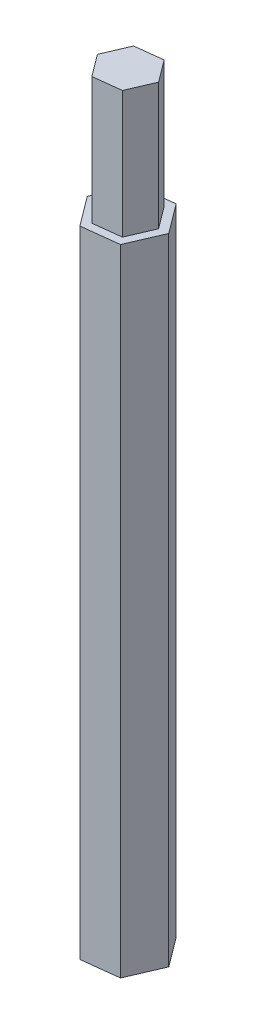
ISO-10303-21;
HEADER;
FILE_DESCRIPTION(('STEP AP214'),'2;1');
FILE_NAME('part.step','',(''),(''),'','','');
FILE_SCHEMA(('AUTOMOTIVE_DESIGN { 1 0 10303 214 1 1 1 1 }'));
ENDSEC;
DATA;
#1=APPLICATION_CONTEXT('core data for automotive mechanical design processes');
#2=APPLICATION_PROTOCOL_DEFINITION('international standard','automotive_design',2000,#1);
#3=PRODUCT_CONTEXT('',#1,'mechanical');
#4=PRODUCT('Part','Part','',(#3));
#5=PRODUCT_RELATED_PRODUCT_CATEGORY('part','',(#4));
#6=PRODUCT_DEFINITION_FORMATION('','',#4);
#7=PRODUCT_DEFINITION_CONTEXT('part definition',#1,'design');
#8=PRODUCT_DEFINITION('design','',#6,#7);
#9=PRODUCT_DEFINITION_SHAPE('','',#8);
#10=(LENGTH_UNIT() NAMED_UNIT(*) SI_UNIT(.MILLI.,.METRE.));
#11=(NAMED_UNIT(*) PLANE_ANGLE_UNIT() SI_UNIT($,.RADIAN.));
#12=(NAMED_UNIT(*) SI_UNIT($,.STERADIAN.) SOLID_ANGLE_UNIT());
#13=UNCERTAINTY_MEASURE_WITH_UNIT(LENGTH_MEASURE(1.E-05),#10,'distance_accuracy_value','');
#14=(GEOMETRIC_REPRESENTATION_CONTEXT(3) GLOBAL_UNCERTAINTY_ASSIGNED_CONTEXT((#13)) GLOBAL_UNIT_ASSIGNED_CONTEXT((#10,
#11,#12)) REPRESENTATION_CONTEXT('',''));
#15=CARTESIAN_POINT('',(0.,0.,0.));
#16=DIRECTION('',(0.,0.,1.));
#17=DIRECTION('',(1.,0.,0.));
#18=AXIS2_PLACEMENT_3D('',#15,#16,#17);
#19=CARTESIAN_POINT('',(0.,127.,0.));
#20=DIRECTION('',(0.,1.,0.));
#21=DIRECTION('',(0.,0.,1.));
#22=AXIS2_PLACEMENT_3D('',#19,#20,#21);
#23=PLANE('',#22);
#24=DIRECTION('',(0.993087804691437,0.,-0.117373813830612));
#25=VECTOR('',#24,1.);
#26=CARTESIAN_POINT('',(-2.89550917935946,127.,6.73642040890994));
#27=LINE('',#26,#25);
#28=CARTESIAN_POINT('',(-2.89550917935946,127.,6.73642040890994));
#29=VERTEX_POINT('',#28);
#30=CARTESIAN_POINT('',(4.38615661500823,127.,5.8757947106713));
#31=VERTEX_POINT('',#30);
#32=EDGE_CURVE('E160',#29,#31,#27,.T.);
#33=ORIENTED_EDGE('',*,*,#32,.T.);
#34=DIRECTION('',(0.394895197829344,0.,-0.918726173966609));
#35=VECTOR('',#34,1.);
#36=CARTESIAN_POINT('',(4.38615661500823,127.,5.8757947106713));
#37=LINE('',#36,#35);
#38=CARTESIAN_POINT('',(7.2816657943677,127.,-0.860625698238642));
#39=VERTEX_POINT('',#38);
#40=EDGE_CURVE('E102',#31,#39,#37,.T.);
#41=ORIENTED_EDGE('',*,*,#40,.T.);
#42=DIRECTION('',(-0.598192606862093,0.,-0.801352360135997));
#43=VECTOR('',#42,1.);
#44=CARTESIAN_POINT('',(7.2816657943677,127.,-0.860625698238642));
#45=LINE('',#44,#43);
#46=CARTESIAN_POINT('',(2.89550917935946,127.,-6.73642040890994));
#47=VERTEX_POINT('',#46);
#48=EDGE_CURVE('E122',#39,#47,#45,.T.);
#49=ORIENTED_EDGE('',*,*,#48,.T.);
#50=DIRECTION('',(-0.993087804691437,0.,0.117373813830612));
#51=VECTOR('',#50,1.);
#52=CARTESIAN_POINT('',(2.89550917935946,127.,-6.73642040890994));
#53=LINE('',#52,#51);
#54=CARTESIAN_POINT('',(-4.38615661500823,127.,-5.8757947106713));
#55=VERTEX_POINT('',#54);
#56=EDGE_CURVE('E115',#47,#55,#53,.T.);
#57=ORIENTED_EDGE('',*,*,#56,.T.);
#58=DIRECTION('',(-0.394895197829343,0.,0.918726173966609));
#59=VECTOR('',#58,1.);
#60=CARTESIAN_POINT('',(-4.38615661500823,127.,-5.8757947106713));
#61=LINE('',#60,#59);
#62=CARTESIAN_POINT('',(-7.2816657943677,127.,0.860625698238642));
#63=VERTEX_POINT('',#62);
#64=EDGE_CURVE('E119',#55,#63,#61,.T.);
#65=ORIENTED_EDGE('',*,*,#64,.T.);
#66=DIRECTION('',(0.598192606862093,0.,0.801352360135997));
#67=VECTOR('',#66,1.);
#68=CARTESIAN_POINT('',(-7.2816657943677,127.,0.860625698238642));
#69=LINE('',#68,#67);
#70=EDGE_CURVE('E66',#63,#29,#69,.T.);
#71=ORIENTED_EDGE('',*,*,#70,.T.);
#72=EDGE_LOOP('',(#33,#41,#49,#57,#65,#71));
#73=FACE_BOUND('',#72,.T.);
#74=DIRECTION('',(-0.598192606862093,0.,-0.801352360135997));
#75=VECTOR('',#74,1.);
#76=CARTESIAN_POINT('',(5.46124934577578,127.,-0.645469273678982));
#77=LINE('',#76,#75);
#78=CARTESIAN_POINT('',(5.46124934577578,127.,-0.645469273678982));
#79=VERTEX_POINT('',#78);
#80=CARTESIAN_POINT('',(2.1716318845196,127.,-5.05231530668246));
#81=VERTEX_POINT('',#80);
#82=EDGE_CURVE('E186',#79,#81,#77,.T.);
#83=ORIENTED_EDGE('',*,*,#82,.F.);
#84=DIRECTION('',(0.394895197829343,0.,-0.918726173966609));
#85=VECTOR('',#84,1.);
#86=CARTESIAN_POINT('',(3.28961746125618,127.,4.40684603300348));
#87=LINE('',#86,#85);
#88=CARTESIAN_POINT('',(3.28961746125618,127.,4.40684603300348));
#89=VERTEX_POINT('',#88);
#90=EDGE_CURVE('E190',#89,#79,#87,.T.);
#91=ORIENTED_EDGE('',*,*,#90,.F.);
#92=DIRECTION('',(0.993087804691437,0.,-0.117373813830612));
#93=VECTOR('',#92,1.);
#94=CARTESIAN_POINT('',(-2.1716318845196,127.,5.05231530668246));
#95=LINE('',#94,#93);
#96=CARTESIAN_POINT('',(-2.1716318845196,127.,5.05231530668246));
#97=VERTEX_POINT('',#96);
#98=EDGE_CURVE('E237',#97,#89,#95,.T.);
#99=ORIENTED_EDGE('',*,*,#98,.F.);
#100=DIRECTION('',(0.598192606862093,0.,0.801352360135997));
#101=VECTOR('',#100,1.);
#102=CARTESIAN_POINT('',(-5.46124934577577,127.,0.645469273678983));
#103=LINE('',#102,#101);
#104=CARTESIAN_POINT('',(-5.46124934577577,127.,0.645469273678983));
#105=VERTEX_POINT('',#104);
#106=EDGE_CURVE('E235',#105,#97,#103,.T.);
#107=ORIENTED_EDGE('',*,*,#106,.F.);
#108=DIRECTION('',(-0.394895197829343,0.,0.918726173966609));
#109=VECTOR('',#108,1.);
#110=CARTESIAN_POINT('',(-3.28961746125618,127.,-4.40684603300348));
#111=LINE('',#110,#109);
#112=CARTESIAN_POINT('',(-3.28961746125618,127.,-4.40684603300348));
#113=VERTEX_POINT('',#112);
#114=EDGE_CURVE('E194',#113,#105,#111,.T.);
#115=ORIENTED_EDGE('',*,*,#114,.F.);
#116=DIRECTION('',(-0.993087804691437,0.,0.117373813830612));
#117=VECTOR('',#116,1.);
#118=CARTESIAN_POINT('',(2.1716318845196,127.,-5.05231530668246));
#119=LINE('',#118,#117);
#120=EDGE_CURVE('E189',#81,#113,#119,.T.);
#121=ORIENTED_EDGE('',*,*,#120,.F.);
#122=EDGE_LOOP('',(#83,#91,#99,#107,#115,#121));
#123=FACE_BOUND('',#122,.T.);
#124=ADVANCED_FACE('F39',(#73,#123),#23,.T.);
#125=CARTESIAN_POINT('',(-2.89550917935946,127.,6.73642040890994));
#126=DIRECTION('',(-0.117373813830612,0.,-0.993087804691437));
#127=DIRECTION('',(-0.993087804691437,0.,0.117373813830612));
#128=AXIS2_PLACEMENT_3D('',#125,#126,#127);
#129=PLANE('',#128);
#130=DIRECTION('',(0.993087804691437,0.,-0.117373813830612));
#131=VECTOR('',#130,1.);
#132=CARTESIAN_POINT('',(-2.89550917935946,0.,6.73642040890994));
#133=LINE('',#132,#131);
#134=CARTESIAN_POINT('',(-2.89550917935946,0.,6.73642040890994));
#135=VERTEX_POINT('',#134);
#136=CARTESIAN_POINT('',(4.38615661500823,0.,5.8757947106713));
#137=VERTEX_POINT('',#136);
#138=EDGE_CURVE('E148',#135,#137,#133,.T.);
#139=ORIENTED_EDGE('',*,*,#138,.T.);
#140=DIRECTION('',(0.,-1.,0.));
#141=VECTOR('',#140,1.);
#142=CARTESIAN_POINT('',(4.38615661500823,127.,5.8757947106713));
#143=LINE('',#142,#141);
#144=EDGE_CURVE('E11',#31,#137,#143,.T.);
#145=ORIENTED_EDGE('',*,*,#144,.F.);
#146=ORIENTED_EDGE('',*,*,#32,.F.);
#147=DIRECTION('',(0.,-1.,0.));
#148=VECTOR('',#147,1.);
#149=CARTESIAN_POINT('',(-2.89550917935946,127.,6.73642040890994));
#150=LINE('',#149,#148);
#151=EDGE_CURVE('E144',#29,#135,#150,.T.);
#152=ORIENTED_EDGE('',*,*,#151,.T.);
#153=EDGE_LOOP('',(#139,#145,#146,#152));
#154=FACE_BOUND('',#153,.T.);
#155=ADVANCED_FACE('F41',(#154),#129,.F.);
#156=CARTESIAN_POINT('',(4.38615661500823,127.,5.8757947106713));
#157=DIRECTION('',(-0.918726173966609,0.,-0.394895197829344));
#158=DIRECTION('',(-0.394895197829344,0.,0.918726173966609));
#159=AXIS2_PLACEMENT_3D('',#156,#157,#158);
#160=PLANE('',#159);
#161=DIRECTION('',(0.394895197829344,0.,-0.918726173966609));
#162=VECTOR('',#161,1.);
#163=CARTESIAN_POINT('',(4.38615661500823,0.,5.8757947106713));
#164=LINE('',#163,#162);
#165=CARTESIAN_POINT('',(7.2816657943677,0.,-0.860625698238642));
#166=VERTEX_POINT('',#165);
#167=EDGE_CURVE('E151',#137,#166,#164,.T.);
#168=ORIENTED_EDGE('',*,*,#167,.T.);
#169=DIRECTION('',(0.,-1.,0.));
#170=VECTOR('',#169,1.);
#171=CARTESIAN_POINT('',(7.2816657943677,127.,-0.860625698238642));
#172=LINE('',#171,#170);
#173=EDGE_CURVE('E47',#39,#166,#172,.T.);
#174=ORIENTED_EDGE('',*,*,#173,.F.);
#175=ORIENTED_EDGE('',*,*,#40,.F.);
#176=ORIENTED_EDGE('',*,*,#144,.T.);
#177=EDGE_LOOP('',(#168,#174,#175,#176));
#178=FACE_BOUND('',#177,.T.);
#179=ADVANCED_FACE('F318',(#178),#160,.F.);
#180=CARTESIAN_POINT('',(7.2816657943677,127.,-0.860625698238642));
#181=DIRECTION('',(-0.801352360135997,0.,0.598192606862093));
#182=DIRECTION('',(0.598192606862093,0.,0.801352360135997));
#183=AXIS2_PLACEMENT_3D('',#180,#181,#182);
#184=PLANE('',#183);
#185=DIRECTION('',(-0.598192606862093,0.,-0.801352360135997));
#186=VECTOR('',#185,1.);
#187=CARTESIAN_POINT('',(7.2816657943677,0.,-0.860625698238642));
#188=LINE('',#187,#186);
#189=CARTESIAN_POINT('',(2.89550917935946,0.,-6.73642040890994));
#190=VERTEX_POINT('',#189);
#191=EDGE_CURVE('E154',#166,#190,#188,.T.);
#192=ORIENTED_EDGE('',*,*,#191,.T.);
#193=DIRECTION('',(0.,-1.,0.));
#194=VECTOR('',#193,1.);
#195=CARTESIAN_POINT('',(2.89550917935946,127.,-6.73642040890994));
#196=LINE('',#195,#194);
#197=EDGE_CURVE('E136',#47,#190,#196,.T.);
#198=ORIENTED_EDGE('',*,*,#197,.F.);
#199=ORIENTED_EDGE('',*,*,#48,.F.);
#200=ORIENTED_EDGE('',*,*,#173,.T.);
#201=EDGE_LOOP('',(#192,#198,#199,#200));
#202=FACE_BOUND('',#201,.T.);
#203=ADVANCED_FACE('F170',(#202),#184,.F.);
#204=CARTESIAN_POINT('',(2.89550917935946,127.,-6.73642040890994));
#205=DIRECTION('',(0.117373813830612,0.,0.993087804691437));
#206=DIRECTION('',(0.993087804691437,0.,-0.117373813830612));
#207=AXIS2_PLACEMENT_3D('',#204,#205,#206);
#208=PLANE('',#207);
#209=DIRECTION('',(-0.993087804691437,0.,0.117373813830612));
#210=VECTOR('',#209,1.);
#211=CARTESIAN_POINT('',(2.89550917935946,0.,-6.73642040890994));
#212=LINE('',#211,#210);
#213=CARTESIAN_POINT('',(-4.38615661500823,0.,-5.8757947106713));
#214=VERTEX_POINT('',#213);
#215=EDGE_CURVE('E132',#190,#214,#212,.T.);
#216=ORIENTED_EDGE('',*,*,#215,.T.);
#217=DIRECTION('',(0.,-1.,0.));
#218=VECTOR('',#217,1.);
#219=CARTESIAN_POINT('',(-4.38615661500823,127.,-5.8757947106713));
#220=LINE('',#219,#218);
#221=EDGE_CURVE('E129',#55,#214,#220,.T.);
#222=ORIENTED_EDGE('',*,*,#221,.F.);
#223=ORIENTED_EDGE('',*,*,#56,.F.);
#224=ORIENTED_EDGE('',*,*,#197,.T.);
#225=EDGE_LOOP('',(#216,#222,#223,#224));
#226=FACE_BOUND('',#225,.T.);
#227=ADVANCED_FACE('F130',(#226),#208,.F.);
#228=CARTESIAN_POINT('',(-4.38615661500823,127.,-5.8757947106713));
#229=DIRECTION('',(0.918726173966609,0.,0.394895197829343));
#230=DIRECTION('',(0.394895197829343,0.,-0.918726173966609));
#231=AXIS2_PLACEMENT_3D('',#228,#229,#230);
#232=PLANE('',#231);
#233=DIRECTION('',(-0.394895197829343,0.,0.918726173966609));
#234=VECTOR('',#233,1.);
#235=CARTESIAN_POINT('',(-4.38615661500823,0.,-5.8757947106713));
#236=LINE('',#235,#234);
#237=CARTESIAN_POINT('',(-7.2816657943677,0.,0.860625698238642));
#238=VERTEX_POINT('',#237);
#239=EDGE_CURVE('E157',#214,#238,#236,.T.);
#240=ORIENTED_EDGE('',*,*,#239,.T.);
#241=DIRECTION('',(0.,-1.,0.));
#242=VECTOR('',#241,1.);
#243=CARTESIAN_POINT('',(-7.2816657943677,127.,0.860625698238642));
#244=LINE('',#243,#242);
#245=EDGE_CURVE('E137',#63,#238,#244,.T.);
#246=ORIENTED_EDGE('',*,*,#245,.F.);
#247=ORIENTED_EDGE('',*,*,#64,.F.);
#248=ORIENTED_EDGE('',*,*,#221,.T.);
#249=EDGE_LOOP('',(#240,#246,#247,#248));
#250=FACE_BOUND('',#249,.T.);
#251=ADVANCED_FACE('F139',(#250),#232,.F.);
#252=CARTESIAN_POINT('',(-7.2816657943677,127.,0.860625698238642));
#253=DIRECTION('',(0.801352360135997,0.,-0.598192606862093));
#254=DIRECTION('',(-0.598192606862093,0.,-0.801352360135997));
#255=AXIS2_PLACEMENT_3D('',#252,#253,#254);
#256=PLANE('',#255);
#257=DIRECTION('',(0.598192606862093,0.,0.801352360135997));
#258=VECTOR('',#257,1.);
#259=CARTESIAN_POINT('',(-7.2816657943677,0.,0.860625698238642));
#260=LINE('',#259,#258);
#261=EDGE_CURVE('E94',#238,#135,#260,.T.);
#262=ORIENTED_EDGE('',*,*,#261,.T.);
#263=ORIENTED_EDGE('',*,*,#151,.F.);
#264=ORIENTED_EDGE('',*,*,#70,.F.);
#265=ORIENTED_EDGE('',*,*,#245,.T.);
#266=EDGE_LOOP('',(#262,#263,#264,#265));
#267=FACE_BOUND('',#266,.T.);
#268=ADVANCED_FACE('F174',(#267),#256,.F.);
#269=CARTESIAN_POINT('',(0.,0.,0.));
#270=DIRECTION('',(0.,1.,0.));
#271=DIRECTION('',(0.,0.,1.));
#272=AXIS2_PLACEMENT_3D('',#269,#270,#271);
#273=PLANE('',#272);
#274=ORIENTED_EDGE('',*,*,#138,.F.);
#275=ORIENTED_EDGE('',*,*,#261,.F.);
#276=ORIENTED_EDGE('',*,*,#239,.F.);
#277=ORIENTED_EDGE('',*,*,#215,.F.);
#278=ORIENTED_EDGE('',*,*,#191,.F.);
#279=ORIENTED_EDGE('',*,*,#167,.F.);
#280=EDGE_LOOP('',(#274,#275,#276,#277,#278,#279));
#281=FACE_BOUND('',#280,.T.);
#282=ADVANCED_FACE('F173',(#281),#273,.F.);
#283=CARTESIAN_POINT('',(3.28961746125618,152.4,4.40684603300348));
#284=DIRECTION('',(-0.918726173966609,0.,-0.394895197829343));
#285=DIRECTION('',(-0.394895197829343,0.,0.918726173966609));
#286=AXIS2_PLACEMENT_3D('',#283,#284,#285);
#287=PLANE('',#286);
#288=ORIENTED_EDGE('',*,*,#90,.T.);
#289=DIRECTION('',(0.,-1.,0.));
#290=VECTOR('',#289,1.);
#291=CARTESIAN_POINT('',(5.46124934577578,152.4,-0.645469273678982));
#292=LINE('',#291,#290);
#293=CARTESIAN_POINT('',(5.46124934577578,152.4,-0.645469273678982));
#294=VERTEX_POINT('',#293);
#295=EDGE_CURVE('E152',#294,#79,#292,.T.);
#296=ORIENTED_EDGE('',*,*,#295,.F.);
#297=DIRECTION('',(0.394895197829343,0.,-0.918726173966609));
#298=VECTOR('',#297,1.);
#299=CARTESIAN_POINT('',(3.28961746125618,152.4,4.40684603300348));
#300=LINE('',#299,#298);
#301=CARTESIAN_POINT('',(3.28961746125618,152.4,4.40684603300348));
#302=VERTEX_POINT('',#301);
#303=EDGE_CURVE('E240',#302,#294,#300,.T.);
#304=ORIENTED_EDGE('',*,*,#303,.F.);
#305=DIRECTION('',(0.,-1.,0.));
#306=VECTOR('',#305,1.);
#307=CARTESIAN_POINT('',(3.28961746125618,152.4,4.40684603300348));
#308=LINE('',#307,#306);
#309=EDGE_CURVE('E200',#302,#89,#308,.T.);
#310=ORIENTED_EDGE('',*,*,#309,.T.);
#311=EDGE_LOOP('',(#288,#296,#304,#310));
#312=FACE_BOUND('',#311,.T.);
#313=ADVANCED_FACE('F272',(#312),#287,.F.);
#314=CARTESIAN_POINT('',(5.46124934577578,152.4,-0.645469273678982));
#315=DIRECTION('',(-0.801352360135997,0.,0.598192606862093));
#316=DIRECTION('',(0.598192606862093,0.,0.801352360135998));
#317=AXIS2_PLACEMENT_3D('',#314,#315,#316);
#318=PLANE('',#317);
#319=ORIENTED_EDGE('',*,*,#82,.T.);
#320=DIRECTION('',(0.,-1.,0.));
#321=VECTOR('',#320,1.);
#322=CARTESIAN_POINT('',(2.1716318845196,152.4,-5.05231530668246));
#323=LINE('',#322,#321);
#324=CARTESIAN_POINT('',(2.1716318845196,152.4,-5.05231530668246));
#325=VERTEX_POINT('',#324);
#326=EDGE_CURVE('E196',#325,#81,#323,.T.);
#327=ORIENTED_EDGE('',*,*,#326,.F.);
#328=DIRECTION('',(-0.598192606862093,0.,-0.801352360135997));
#329=VECTOR('',#328,1.);
#330=CARTESIAN_POINT('',(5.46124934577578,152.4,-0.645469273678982));
#331=LINE('',#330,#329);
#332=EDGE_CURVE('E244',#294,#325,#331,.T.);
#333=ORIENTED_EDGE('',*,*,#332,.F.);
#334=ORIENTED_EDGE('',*,*,#295,.T.);
#335=EDGE_LOOP('',(#319,#327,#333,#334));
#336=FACE_BOUND('',#335,.T.);
#337=ADVANCED_FACE('F278',(#336),#318,.F.);
#338=CARTESIAN_POINT('',(2.1716318845196,152.4,-5.05231530668246));
#339=DIRECTION('',(0.117373813830612,0.,0.993087804691437));
#340=DIRECTION('',(0.993087804691437,0.,-0.117373813830612));
#341=AXIS2_PLACEMENT_3D('',#338,#339,#340);
#342=PLANE('',#341);
#343=ORIENTED_EDGE('',*,*,#120,.T.);
#344=DIRECTION('',(0.,-1.,0.));
#345=VECTOR('',#344,1.);
#346=CARTESIAN_POINT('',(-3.28961746125618,152.4,-4.40684603300348));
#347=LINE('',#346,#345);
#348=CARTESIAN_POINT('',(-3.28961746125618,152.4,-4.40684603300348));
#349=VERTEX_POINT('',#348);
#350=EDGE_CURVE('E199',#349,#113,#347,.T.);
#351=ORIENTED_EDGE('',*,*,#350,.F.);
#352=DIRECTION('',(-0.993087804691437,0.,0.117373813830612));
#353=VECTOR('',#352,1.);
#354=CARTESIAN_POINT('',(2.1716318845196,152.4,-5.05231530668246));
#355=LINE('',#354,#353);
#356=EDGE_CURVE('E255',#325,#349,#355,.T.);
#357=ORIENTED_EDGE('',*,*,#356,.F.);
#358=ORIENTED_EDGE('',*,*,#326,.T.);
#359=EDGE_LOOP('',(#343,#351,#357,#358));
#360=FACE_BOUND('',#359,.T.);
#361=ADVANCED_FACE('F283',(#360),#342,.F.);
#362=CARTESIAN_POINT('',(-3.28961746125618,152.4,-4.40684603300348));
#363=DIRECTION('',(0.918726173966609,0.,0.394895197829343));
#364=DIRECTION('',(0.394895197829343,0.,-0.918726173966609));
#365=AXIS2_PLACEMENT_3D('',#362,#363,#364);
#366=PLANE('',#365);
#367=ORIENTED_EDGE('',*,*,#114,.T.);
#368=DIRECTION('',(0.,-1.,0.));
#369=VECTOR('',#368,1.);
#370=CARTESIAN_POINT('',(-5.46124934577577,152.4,0.645469273678983));
#371=LINE('',#370,#369);
#372=CARTESIAN_POINT('',(-5.46124934577577,152.4,0.645469273678983));
#373=VERTEX_POINT('',#372);
#374=EDGE_CURVE('E205',#373,#105,#371,.T.);
#375=ORIENTED_EDGE('',*,*,#374,.F.);
#376=DIRECTION('',(-0.394895197829343,0.,0.918726173966609));
#377=VECTOR('',#376,1.);
#378=CARTESIAN_POINT('',(-3.28961746125618,152.4,-4.40684603300348));
#379=LINE('',#378,#377);
#380=EDGE_CURVE('E226',#349,#373,#379,.T.);
#381=ORIENTED_EDGE('',*,*,#380,.F.);
#382=ORIENTED_EDGE('',*,*,#350,.T.);
#383=EDGE_LOOP('',(#367,#375,#381,#382));
#384=FACE_BOUND('',#383,.T.);
#385=ADVANCED_FACE('F221',(#384),#366,.F.);
#386=CARTESIAN_POINT('',(-5.46124934577577,152.4,0.645469273678983));
#387=DIRECTION('',(0.801352360135997,0.,-0.598192606862093));
#388=DIRECTION('',(-0.598192606862093,0.,-0.801352360135997));
#389=AXIS2_PLACEMENT_3D('',#386,#387,#388);
#390=PLANE('',#389);
#391=ORIENTED_EDGE('',*,*,#106,.T.);
#392=DIRECTION('',(0.,-1.,0.));
#393=VECTOR('',#392,1.);
#394=CARTESIAN_POINT('',(-2.1716318845196,152.4,5.05231530668246));
#395=LINE('',#394,#393);
#396=CARTESIAN_POINT('',(-2.1716318845196,152.4,5.05231530668246));
#397=VERTEX_POINT('',#396);
#398=EDGE_CURVE('E57',#397,#97,#395,.T.);
#399=ORIENTED_EDGE('',*,*,#398,.F.);
#400=DIRECTION('',(0.598192606862093,0.,0.801352360135997));
#401=VECTOR('',#400,1.);
#402=CARTESIAN_POINT('',(-5.46124934577577,152.4,0.645469273678983));
#403=LINE('',#402,#401);
#404=EDGE_CURVE('E262',#373,#397,#403,.T.);
#405=ORIENTED_EDGE('',*,*,#404,.F.);
#406=ORIENTED_EDGE('',*,*,#374,.T.);
#407=EDGE_LOOP('',(#391,#399,#405,#406));
#408=FACE_BOUND('',#407,.T.);
#409=ADVANCED_FACE('F302',(#408),#390,.F.);
#410=CARTESIAN_POINT('',(-2.1716318845196,152.4,5.05231530668246));
#411=DIRECTION('',(-0.117373813830612,0.,-0.993087804691437));
#412=DIRECTION('',(-0.993087804691437,0.,0.117373813830612));
#413=AXIS2_PLACEMENT_3D('',#410,#411,#412);
#414=PLANE('',#413);
#415=ORIENTED_EDGE('',*,*,#98,.T.);
#416=ORIENTED_EDGE('',*,*,#309,.F.);
#417=DIRECTION('',(0.993087804691437,0.,-0.117373813830612));
#418=VECTOR('',#417,1.);
#419=CARTESIAN_POINT('',(-2.1716318845196,152.4,5.05231530668246));
#420=LINE('',#419,#418);
#421=EDGE_CURVE('E203',#397,#302,#420,.T.);
#422=ORIENTED_EDGE('',*,*,#421,.F.);
#423=ORIENTED_EDGE('',*,*,#398,.T.);
#424=EDGE_LOOP('',(#415,#416,#422,#423));
#425=FACE_BOUND('',#424,.T.);
#426=ADVANCED_FACE('F300',(#425),#414,.F.);
#427=CARTESIAN_POINT('',(0.,152.4,0.));
#428=DIRECTION('',(0.,1.,0.));
#429=DIRECTION('',(0.,0.,1.));
#430=AXIS2_PLACEMENT_3D('',#427,#428,#429);
#431=PLANE('',#430);
#432=ORIENTED_EDGE('',*,*,#303,.T.);
#433=ORIENTED_EDGE('',*,*,#332,.T.);
#434=ORIENTED_EDGE('',*,*,#356,.T.);
#435=ORIENTED_EDGE('',*,*,#380,.T.);
#436=ORIENTED_EDGE('',*,*,#404,.T.);
#437=ORIENTED_EDGE('',*,*,#421,.T.);
#438=EDGE_LOOP('',(#432,#433,#434,#435,#436,#437));
#439=FACE_BOUND('',#438,.T.);
#440=ADVANCED_FACE('F286',(#439),#431,.T.);
#441=CLOSED_SHELL('',(#124,#155,#179,#203,#227,#251,#268,#282,#313,#337,#361,#385,#409,#426,#440));
#442=MANIFOLD_SOLID_BREP('B2',#441);
#443=ADVANCED_BREP_SHAPE_REPRESENTATION('',(#18,#442),#14);
#444=SHAPE_DEFINITION_REPRESENTATION(#9,#443);
ENDSEC;
END-ISO-10303-21;
